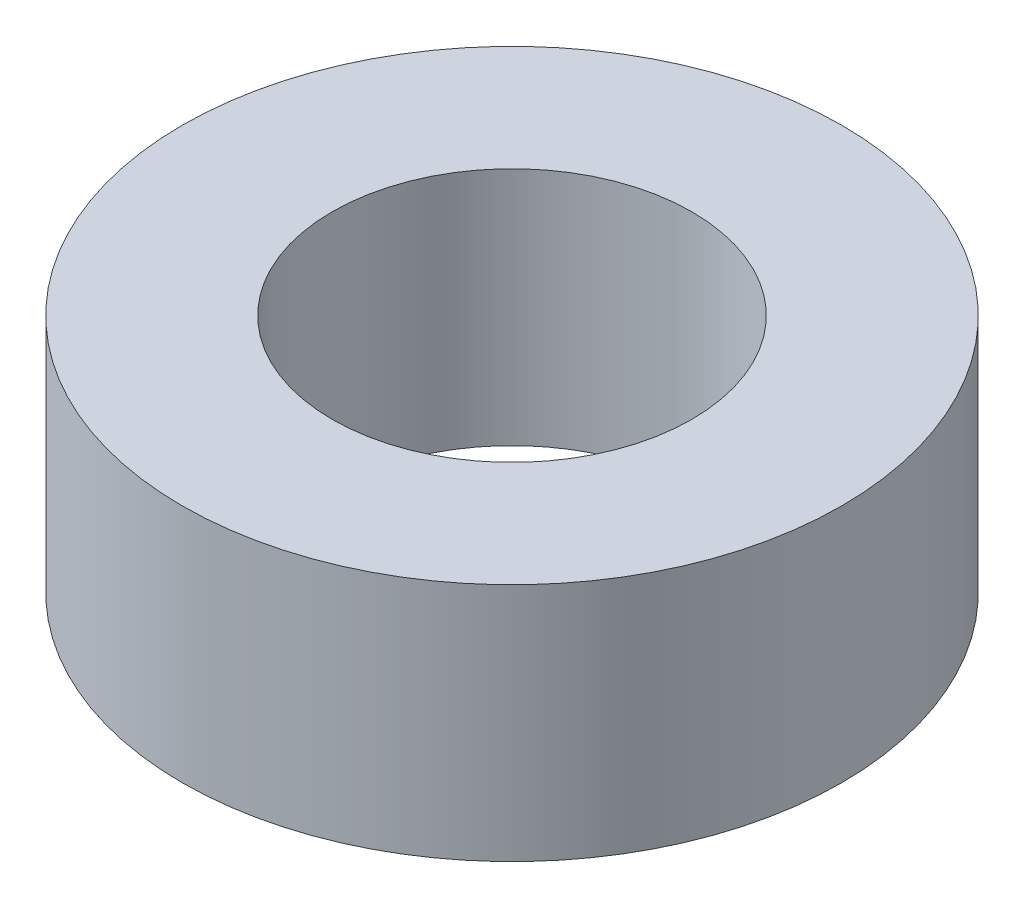
ISO-10303-21;
HEADER;
FILE_DESCRIPTION(('STEP AP214'),'2;1');
FILE_NAME('part.step','',(''),(''),'','','');
FILE_SCHEMA(('AUTOMOTIVE_DESIGN { 1 0 10303 214 1 1 1 1 }'));
ENDSEC;
DATA;
#1=APPLICATION_CONTEXT('core data for automotive mechanical design processes');
#2=APPLICATION_PROTOCOL_DEFINITION('international standard','automotive_design',2000,#1);
#3=PRODUCT_CONTEXT('',#1,'mechanical');
#4=PRODUCT('Part','Part','',(#3));
#5=PRODUCT_RELATED_PRODUCT_CATEGORY('part','',(#4));
#6=PRODUCT_DEFINITION_FORMATION('','',#4);
#7=PRODUCT_DEFINITION_CONTEXT('part definition',#1,'design');
#8=PRODUCT_DEFINITION('design','',#6,#7);
#9=PRODUCT_DEFINITION_SHAPE('','',#8);
#10=(LENGTH_UNIT() NAMED_UNIT(*) SI_UNIT(.MILLI.,.METRE.));
#11=(NAMED_UNIT(*) PLANE_ANGLE_UNIT() SI_UNIT($,.RADIAN.));
#12=(NAMED_UNIT(*) SI_UNIT($,.STERADIAN.) SOLID_ANGLE_UNIT());
#13=UNCERTAINTY_MEASURE_WITH_UNIT(LENGTH_MEASURE(1.E-05),#10,'distance_accuracy_value','');
#14=(GEOMETRIC_REPRESENTATION_CONTEXT(3) GLOBAL_UNCERTAINTY_ASSIGNED_CONTEXT((#13)) GLOBAL_UNIT_ASSIGNED_CONTEXT((#10,
#11,#12)) REPRESENTATION_CONTEXT('',''));
#15=CARTESIAN_POINT('',(0.,0.,0.));
#16=DIRECTION('',(0.,0.,1.));
#17=DIRECTION('',(1.,0.,0.));
#18=AXIS2_PLACEMENT_3D('',#15,#16,#17);
#19=CARTESIAN_POINT('',(0.,2.,0.));
#20=DIRECTION('',(0.,1.,0.));
#21=DIRECTION('',(0.,0.,1.));
#22=AXIS2_PLACEMENT_3D('',#19,#20,#21);
#23=PLANE('',#22);
#24=CARTESIAN_POINT('',(0.,2.,0.));
#25=DIRECTION('',(0.,1.,0.));
#26=DIRECTION('',(0.,0.,1.));
#27=AXIS2_PLACEMENT_3D('',#24,#25,#26);
#28=CIRCLE('',#27,2.75);
#29=CARTESIAN_POINT('',(0.,2.,2.75));
#30=VERTEX_POINT('',#29);
#31=EDGE_CURVE('E10',#30,#30,#28,.T.);
#32=ORIENTED_EDGE('',*,*,#31,.T.);
#33=EDGE_LOOP('',(#32));
#34=FACE_BOUND('',#33,.T.);
#35=CARTESIAN_POINT('',(0.,2.,0.));
#36=DIRECTION('',(0.,1.,0.));
#37=DIRECTION('',(0.,0.,1.));
#38=AXIS2_PLACEMENT_3D('',#35,#36,#37);
#39=CIRCLE('',#38,1.5);
#40=CARTESIAN_POINT('',(0.,2.,1.5));
#41=VERTEX_POINT('',#40);
#42=EDGE_CURVE('E42',#41,#41,#39,.T.);
#43=ORIENTED_EDGE('',*,*,#42,.F.);
#44=EDGE_LOOP('',(#43));
#45=FACE_BOUND('',#44,.T.);
#46=ADVANCED_FACE('F31',(#34,#45),#23,.T.);
#47=CARTESIAN_POINT('',(0.,0.,0.));
#48=DIRECTION('',(0.,1.,0.));
#49=DIRECTION('',(0.,0.,1.));
#50=AXIS2_PLACEMENT_3D('',#47,#48,#49);
#51=PLANE('',#50);
#52=CARTESIAN_POINT('',(0.,0.,0.));
#53=DIRECTION('',(0.,1.,0.));
#54=DIRECTION('',(0.,0.,1.));
#55=AXIS2_PLACEMENT_3D('',#52,#53,#54);
#56=CIRCLE('',#55,2.75);
#57=CARTESIAN_POINT('',(0.,0.,2.75));
#58=VERTEX_POINT('',#57);
#59=EDGE_CURVE('E35',#58,#58,#56,.T.);
#60=ORIENTED_EDGE('',*,*,#59,.F.);
#61=EDGE_LOOP('',(#60));
#62=FACE_BOUND('',#61,.T.);
#63=CARTESIAN_POINT('',(0.,0.,0.));
#64=DIRECTION('',(0.,1.,0.));
#65=DIRECTION('',(0.,0.,1.));
#66=AXIS2_PLACEMENT_3D('',#63,#64,#65);
#67=CIRCLE('',#66,1.5);
#68=CARTESIAN_POINT('',(0.,0.,1.5));
#69=VERTEX_POINT('',#68);
#70=EDGE_CURVE('E44',#69,#69,#67,.T.);
#71=ORIENTED_EDGE('',*,*,#70,.T.);
#72=EDGE_LOOP('',(#71));
#73=FACE_BOUND('',#72,.T.);
#74=ADVANCED_FACE('F54',(#62,#73),#51,.F.);
#75=CARTESIAN_POINT('',(0.,2.,0.));
#76=DIRECTION('',(0.,-1.,0.));
#77=DIRECTION('',(0.,0.,-1.));
#78=AXIS2_PLACEMENT_3D('',#75,#76,#77);
#79=CYLINDRICAL_SURFACE('',#78,2.75);
#80=ORIENTED_EDGE('',*,*,#31,.F.);
#81=EDGE_LOOP('',(#80));
#82=FACE_BOUND('',#81,.T.);
#83=ORIENTED_EDGE('',*,*,#59,.T.);
#84=EDGE_LOOP('',(#83));
#85=FACE_BOUND('',#84,.T.);
#86=ADVANCED_FACE('F33',(#82,#85),#79,.T.);
#87=CARTESIAN_POINT('',(0.,2.,0.));
#88=DIRECTION('',(0.,-1.,0.));
#89=DIRECTION('',(0.,0.,-1.));
#90=AXIS2_PLACEMENT_3D('',#87,#88,#89);
#91=CYLINDRICAL_SURFACE('',#90,1.5);
#92=ORIENTED_EDGE('',*,*,#42,.T.);
#93=EDGE_LOOP('',(#92));
#94=FACE_BOUND('',#93,.T.);
#95=ORIENTED_EDGE('',*,*,#70,.F.);
#96=EDGE_LOOP('',(#95));
#97=FACE_BOUND('',#96,.T.);
#98=ADVANCED_FACE('F50',(#94,#97),#91,.F.);
#99=CLOSED_SHELL('',(#46,#74,#86,#98));
#100=MANIFOLD_SOLID_BREP('B2',#99);
#101=ADVANCED_BREP_SHAPE_REPRESENTATION('',(#18,#100),#14);
#102=SHAPE_DEFINITION_REPRESENTATION(#9,#101);
ENDSEC;
END-ISO-10303-21;
